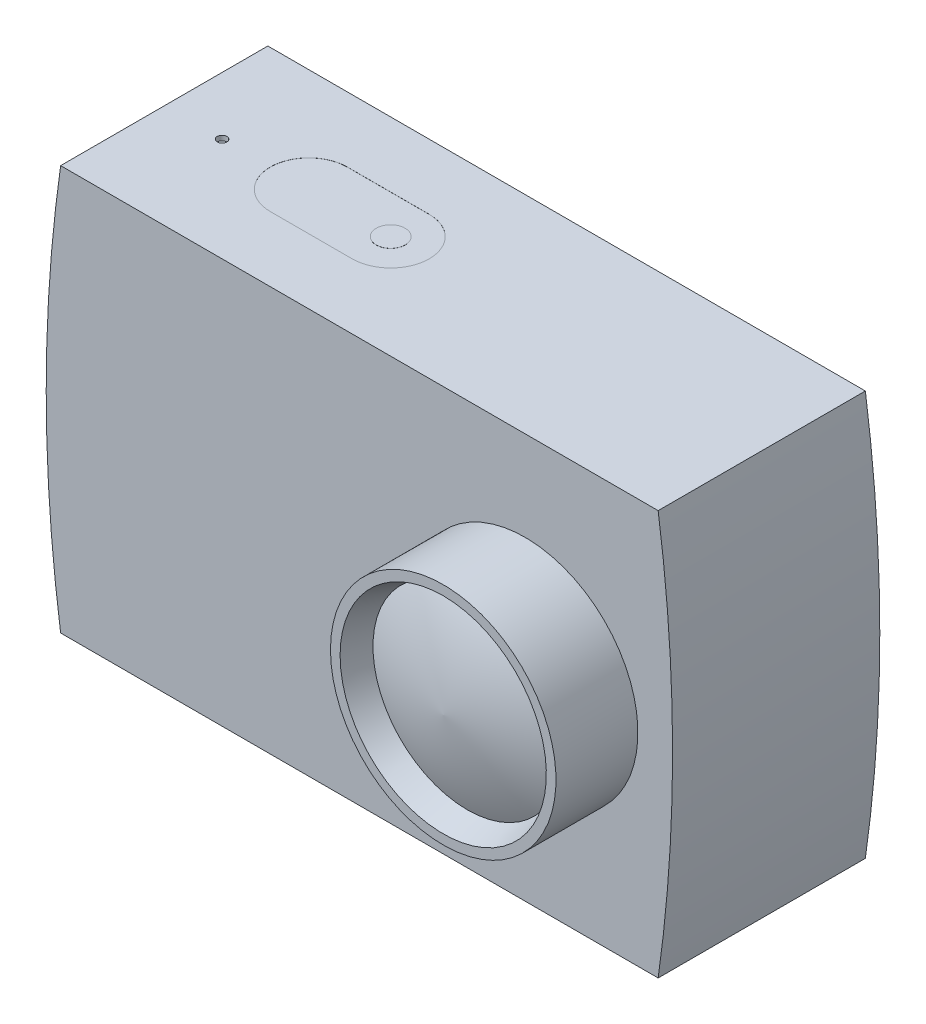
ISO-10303-21;
HEADER;
FILE_DESCRIPTION(('STEP AP214'),'2;1');
FILE_NAME('part.step','',(''),(''),'','','');
FILE_SCHEMA(('AUTOMOTIVE_DESIGN { 1 0 10303 214 1 1 1 1 }'));
ENDSEC;
DATA;
#1=APPLICATION_CONTEXT('core data for automotive mechanical design processes');
#2=APPLICATION_PROTOCOL_DEFINITION('international standard','automotive_design',2000,#1);
#3=PRODUCT_CONTEXT('',#1,'mechanical');
#4=PRODUCT('Part','Part','',(#3));
#5=PRODUCT_RELATED_PRODUCT_CATEGORY('part','',(#4));
#6=PRODUCT_DEFINITION_FORMATION('','',#4);
#7=PRODUCT_DEFINITION_CONTEXT('part definition',#1,'design');
#8=PRODUCT_DEFINITION('design','',#6,#7);
#9=PRODUCT_DEFINITION_SHAPE('','',#8);
#10=(LENGTH_UNIT() NAMED_UNIT(*) SI_UNIT(.MILLI.,.METRE.));
#11=(NAMED_UNIT(*) PLANE_ANGLE_UNIT() SI_UNIT($,.RADIAN.));
#12=(NAMED_UNIT(*) SI_UNIT($,.STERADIAN.) SOLID_ANGLE_UNIT());
#13=UNCERTAINTY_MEASURE_WITH_UNIT(LENGTH_MEASURE(1.E-05),#10,'distance_accuracy_value','');
#14=(GEOMETRIC_REPRESENTATION_CONTEXT(3) GLOBAL_UNCERTAINTY_ASSIGNED_CONTEXT((#13)) GLOBAL_UNIT_ASSIGNED_CONTEXT((#10,
#11,#12)) REPRESENTATION_CONTEXT('',''));
#15=CARTESIAN_POINT('',(0.,0.,0.));
#16=DIRECTION('',(0.,0.,1.));
#17=DIRECTION('',(1.,0.,0.));
#18=AXIS2_PLACEMENT_3D('',#15,#16,#17);
#19=CARTESIAN_POINT('',(-146.5025597046,21.,21.5));
#20=DIRECTION('',(0.,0.,-1.));
#21=DIRECTION('',(-1.,0.,0.));
#22=AXIS2_PLACEMENT_3D('',#19,#20,#21);
#23=CYLINDRICAL_SURFACE('',#22,148.);
#24=CARTESIAN_POINT('',(-146.5025597046,21.,0.));
#25=DIRECTION('',(0.,0.,1.));
#26=DIRECTION('',(-1.,0.,0.));
#27=AXIS2_PLACEMENT_3D('',#24,#25,#26);
#28=CIRCLE('',#27,148.);
#29=CARTESIAN_POINT('',(0.,0.,0.));
#30=VERTEX_POINT('',#29);
#31=CARTESIAN_POINT('',(0.,42.,0.));
#32=VERTEX_POINT('',#31);
#33=EDGE_CURVE('E171',#30,#32,#28,.T.);
#34=ORIENTED_EDGE('',*,*,#33,.T.);
#35=DIRECTION('',(0.,0.,-1.));
#36=VECTOR('',#35,1.);
#37=CARTESIAN_POINT('',(0.,42.,21.5));
#38=LINE('',#37,#36);
#39=CARTESIAN_POINT('',(0.,42.,21.5));
#40=VERTEX_POINT('',#39);
#41=EDGE_CURVE('E197',#40,#32,#38,.T.);
#42=ORIENTED_EDGE('',*,*,#41,.F.);
#43=CARTESIAN_POINT('',(-146.5025597046,21.,21.5));
#44=DIRECTION('',(0.,0.,1.));
#45=DIRECTION('',(-1.,0.,0.));
#46=AXIS2_PLACEMENT_3D('',#43,#44,#45);
#47=CIRCLE('',#46,148.);
#48=CARTESIAN_POINT('',(0.,0.,21.5));
#49=VERTEX_POINT('',#48);
#50=EDGE_CURVE('E177',#49,#40,#47,.T.);
#51=ORIENTED_EDGE('',*,*,#50,.F.);
#52=DIRECTION('',(0.,0.,-1.));
#53=VECTOR('',#52,1.);
#54=CARTESIAN_POINT('',(0.,0.,21.5));
#55=LINE('',#54,#53);
#56=EDGE_CURVE('E183',#49,#30,#55,.T.);
#57=ORIENTED_EDGE('',*,*,#56,.T.);
#58=EDGE_LOOP('',(#34,#42,#51,#57));
#59=FACE_BOUND('',#58,.T.);
#60=ADVANCED_FACE('F45',(#59),#23,.T.);
#61=CARTESIAN_POINT('',(-62.,42.,21.5));
#62=DIRECTION('',(0.,-1.,0.));
#63=DIRECTION('',(0.,0.,-1.));
#64=AXIS2_PLACEMENT_3D('',#61,#62,#63);
#65=PLANE('',#64);
#66=CARTESIAN_POINT('',(-56.,42.,10.75));
#67=DIRECTION('',(0.,1.,0.));
#68=DIRECTION('',(0.,0.,1.));
#69=AXIS2_PLACEMENT_3D('',#66,#67,#68);
#70=CIRCLE('',#69,0.499999999999999);
#71=CARTESIAN_POINT('',(-56.,42.,11.25));
#72=VERTEX_POINT('',#71);
#73=EDGE_CURVE('E137',#72,#72,#70,.T.);
#74=ORIENTED_EDGE('',*,*,#73,.F.);
#75=EDGE_LOOP('',(#74));
#76=FACE_BOUND('',#75,.T.);
#77=DIRECTION('',(1.,0.,0.));
#78=VECTOR('',#77,1.);
#79=CARTESIAN_POINT('',(-47.,42.,14.75));
#80=LINE('',#79,#78);
#81=CARTESIAN_POINT('',(-47.,42.,14.75));
#82=VERTEX_POINT('',#81);
#83=CARTESIAN_POINT('',(-38.5,42.,14.75));
#84=VERTEX_POINT('',#83);
#85=EDGE_CURVE('E161',#82,#84,#80,.T.);
#86=ORIENTED_EDGE('',*,*,#85,.F.);
#87=CARTESIAN_POINT('',(-47.,42.,10.75));
#88=DIRECTION('',(0.,1.,0.));
#89=DIRECTION('',(0.,0.,-1.));
#90=AXIS2_PLACEMENT_3D('',#87,#88,#89);
#91=CIRCLE('',#90,4.);
#92=CARTESIAN_POINT('',(-47.,42.,6.75));
#93=VERTEX_POINT('',#92);
#94=EDGE_CURVE('E59',#93,#82,#91,.T.);
#95=ORIENTED_EDGE('',*,*,#94,.F.);
#96=DIRECTION('',(-1.,0.,0.));
#97=VECTOR('',#96,1.);
#98=CARTESIAN_POINT('',(-47.,42.,6.75));
#99=LINE('',#98,#97);
#100=CARTESIAN_POINT('',(-38.5,42.,6.75000000000002));
#101=VERTEX_POINT('',#100);
#102=EDGE_CURVE('E150',#101,#93,#99,.T.);
#103=ORIENTED_EDGE('',*,*,#102,.F.);
#104=CARTESIAN_POINT('',(-38.5,42.,10.75));
#105=DIRECTION('',(0.,1.,0.));
#106=DIRECTION('',(0.,0.,-1.));
#107=AXIS2_PLACEMENT_3D('',#104,#105,#106);
#108=CIRCLE('',#107,3.99999999999999);
#109=EDGE_CURVE('E164',#84,#101,#108,.T.);
#110=ORIENTED_EDGE('',*,*,#109,.F.);
#111=EDGE_LOOP('',(#86,#95,#103,#110));
#112=FACE_BOUND('',#111,.T.);
#113=DIRECTION('',(-1.,0.,0.));
#114=VECTOR('',#113,1.);
#115=CARTESIAN_POINT('',(-62.,42.,0.));
#116=LINE('',#115,#114);
#117=CARTESIAN_POINT('',(-62.,42.,0.));
#118=VERTEX_POINT('',#117);
#119=EDGE_CURVE('E186',#32,#118,#116,.T.);
#120=ORIENTED_EDGE('',*,*,#119,.T.);
#121=DIRECTION('',(0.,0.,-1.));
#122=VECTOR('',#121,1.);
#123=CARTESIAN_POINT('',(-62.,42.,21.5));
#124=LINE('',#123,#122);
#125=CARTESIAN_POINT('',(-62.,42.,21.5));
#126=VERTEX_POINT('',#125);
#127=EDGE_CURVE('E194',#126,#118,#124,.T.);
#128=ORIENTED_EDGE('',*,*,#127,.F.);
#129=DIRECTION('',(-1.,0.,0.));
#130=VECTOR('',#129,1.);
#131=CARTESIAN_POINT('',(-62.,42.,21.5));
#132=LINE('',#131,#130);
#133=EDGE_CURVE('E97',#40,#126,#132,.T.);
#134=ORIENTED_EDGE('',*,*,#133,.F.);
#135=ORIENTED_EDGE('',*,*,#41,.T.);
#136=EDGE_LOOP('',(#120,#128,#134,#135));
#137=FACE_BOUND('',#136,.T.);
#138=ADVANCED_FACE('F222',(#76,#112,#137),#65,.F.);
#139=CARTESIAN_POINT('',(84.5025597046004,21.,21.5));
#140=DIRECTION('',(0.,0.,-1.));
#141=DIRECTION('',(-1.,0.,0.));
#142=AXIS2_PLACEMENT_3D('',#139,#140,#141);
#143=CYLINDRICAL_SURFACE('',#142,148.);
#144=CARTESIAN_POINT('',(84.5025597046004,21.,0.));
#145=DIRECTION('',(0.,0.,1.));
#146=DIRECTION('',(1.,0.,0.));
#147=AXIS2_PLACEMENT_3D('',#144,#145,#146);
#148=CIRCLE('',#147,148.);
#149=CARTESIAN_POINT('',(-62.,0.,0.));
#150=VERTEX_POINT('',#149);
#151=EDGE_CURVE('E188',#118,#150,#148,.T.);
#152=ORIENTED_EDGE('',*,*,#151,.T.);
#153=DIRECTION('',(0.,0.,-1.));
#154=VECTOR('',#153,1.);
#155=CARTESIAN_POINT('',(-62.,0.,21.5));
#156=LINE('',#155,#154);
#157=CARTESIAN_POINT('',(-62.,0.,21.5));
#158=VERTEX_POINT('',#157);
#159=EDGE_CURVE('E192',#158,#150,#156,.T.);
#160=ORIENTED_EDGE('',*,*,#159,.F.);
#161=CARTESIAN_POINT('',(84.5025597046004,21.,21.5));
#162=DIRECTION('',(0.,0.,1.));
#163=DIRECTION('',(1.,0.,0.));
#164=AXIS2_PLACEMENT_3D('',#161,#162,#163);
#165=CIRCLE('',#164,148.);
#166=EDGE_CURVE('E180',#126,#158,#165,.T.);
#167=ORIENTED_EDGE('',*,*,#166,.F.);
#168=ORIENTED_EDGE('',*,*,#127,.T.);
#169=EDGE_LOOP('',(#152,#160,#167,#168));
#170=FACE_BOUND('',#169,.T.);
#171=ADVANCED_FACE('F224',(#170),#143,.T.);
#172=CARTESIAN_POINT('',(0.,0.,21.5));
#173=DIRECTION('',(0.,1.,0.));
#174=DIRECTION('',(0.,0.,1.));
#175=AXIS2_PLACEMENT_3D('',#172,#173,#174);
#176=PLANE('',#175);
#177=DIRECTION('',(1.,0.,0.));
#178=VECTOR('',#177,1.);
#179=CARTESIAN_POINT('',(0.,0.,0.));
#180=LINE('',#179,#178);
#181=EDGE_CURVE('E89',#150,#30,#180,.T.);
#182=ORIENTED_EDGE('',*,*,#181,.T.);
#183=ORIENTED_EDGE('',*,*,#56,.F.);
#184=DIRECTION('',(1.,0.,0.));
#185=VECTOR('',#184,1.);
#186=CARTESIAN_POINT('',(0.,0.,21.5));
#187=LINE('',#186,#185);
#188=EDGE_CURVE('E68',#158,#49,#187,.T.);
#189=ORIENTED_EDGE('',*,*,#188,.F.);
#190=ORIENTED_EDGE('',*,*,#159,.T.);
#191=EDGE_LOOP('',(#182,#183,#189,#190));
#192=FACE_BOUND('',#191,.T.);
#193=ADVANCED_FACE('F236',(#192),#176,.F.);
#194=CARTESIAN_POINT('',(-146.5025597046,21.,21.5));
#195=DIRECTION('',(0.,0.,-1.));
#196=DIRECTION('',(-1.,0.,0.));
#197=AXIS2_PLACEMENT_3D('',#194,#195,#196);
#198=PLANE('',#197);
#199=CARTESIAN_POINT('',(-13.8025597046004,21.,21.5));
#200=DIRECTION('',(0.,0.,-1.));
#201=DIRECTION('',(-1.,0.,0.));
#202=AXIS2_PLACEMENT_3D('',#199,#200,#201);
#203=CIRCLE('',#202,11.7);
#204=CARTESIAN_POINT('',(-25.5025597046004,21.,21.5));
#205=VERTEX_POINT('',#204);
#206=EDGE_CURVE('E13',#205,#205,#203,.F.);
#207=ORIENTED_EDGE('',*,*,#206,.F.);
#208=EDGE_LOOP('',(#207));
#209=FACE_BOUND('',#208,.T.);
#210=ORIENTED_EDGE('',*,*,#50,.T.);
#211=ORIENTED_EDGE('',*,*,#133,.T.);
#212=ORIENTED_EDGE('',*,*,#166,.T.);
#213=ORIENTED_EDGE('',*,*,#188,.T.);
#214=EDGE_LOOP('',(#210,#211,#212,#213));
#215=FACE_BOUND('',#214,.T.);
#216=ADVANCED_FACE('F238',(#209,#215),#198,.F.);
#217=CARTESIAN_POINT('',(-146.5025597046,21.,0.));
#218=DIRECTION('',(0.,0.,-1.));
#219=DIRECTION('',(-1.,0.,0.));
#220=AXIS2_PLACEMENT_3D('',#217,#218,#219);
#221=PLANE('',#220);
#222=ORIENTED_EDGE('',*,*,#33,.F.);
#223=ORIENTED_EDGE('',*,*,#181,.F.);
#224=ORIENTED_EDGE('',*,*,#151,.F.);
#225=ORIENTED_EDGE('',*,*,#119,.F.);
#226=EDGE_LOOP('',(#222,#223,#224,#225));
#227=FACE_BOUND('',#226,.T.);
#228=ADVANCED_FACE('F233',(#227),#221,.T.);
#229=CARTESIAN_POINT('',(-47.,41.99,10.75));
#230=DIRECTION('',(0.,1.,0.));
#231=DIRECTION('',(0.,0.,1.));
#232=AXIS2_PLACEMENT_3D('',#229,#230,#231);
#233=CYLINDRICAL_SURFACE('',#232,4.);
#234=ORIENTED_EDGE('',*,*,#94,.T.);
#235=DIRECTION('',(0.,1.,0.));
#236=VECTOR('',#235,1.);
#237=CARTESIAN_POINT('',(-47.,41.99,14.75));
#238=LINE('',#237,#236);
#239=CARTESIAN_POINT('',(-47.,41.99,14.75));
#240=VERTEX_POINT('',#239);
#241=EDGE_CURVE('E159',#240,#82,#238,.T.);
#242=ORIENTED_EDGE('',*,*,#241,.F.);
#243=CARTESIAN_POINT('',(-47.,41.99,10.75));
#244=DIRECTION('',(0.,1.,0.));
#245=DIRECTION('',(0.,0.,-1.));
#246=AXIS2_PLACEMENT_3D('',#243,#244,#245);
#247=CIRCLE('',#246,4.);
#248=CARTESIAN_POINT('',(-47.,41.99,6.75));
#249=VERTEX_POINT('',#248);
#250=EDGE_CURVE('E146',#249,#240,#247,.T.);
#251=ORIENTED_EDGE('',*,*,#250,.F.);
#252=DIRECTION('',(0.,1.,0.));
#253=VECTOR('',#252,1.);
#254=CARTESIAN_POINT('',(-47.,41.99,6.75));
#255=LINE('',#254,#253);
#256=EDGE_CURVE('E169',#249,#93,#255,.T.);
#257=ORIENTED_EDGE('',*,*,#256,.T.);
#258=EDGE_LOOP('',(#234,#242,#251,#257));
#259=FACE_BOUND('',#258,.T.);
#260=ADVANCED_FACE('F211',(#259),#233,.F.);
#261=CARTESIAN_POINT('',(-47.,41.99,6.75));
#262=DIRECTION('',(0.,0.,-1.));
#263=DIRECTION('',(-1.,0.,0.));
#264=AXIS2_PLACEMENT_3D('',#261,#262,#263);
#265=PLANE('',#264);
#266=ORIENTED_EDGE('',*,*,#102,.T.);
#267=ORIENTED_EDGE('',*,*,#256,.F.);
#268=DIRECTION('',(-1.,0.,0.));
#269=VECTOR('',#268,1.);
#270=CARTESIAN_POINT('',(-47.,41.99,6.75));
#271=LINE('',#270,#269);
#272=CARTESIAN_POINT('',(-38.5,41.99,6.75000000000002));
#273=VERTEX_POINT('',#272);
#274=EDGE_CURVE('E156',#273,#249,#271,.T.);
#275=ORIENTED_EDGE('',*,*,#274,.F.);
#276=DIRECTION('',(0.,1.,0.));
#277=VECTOR('',#276,1.);
#278=CARTESIAN_POINT('',(-38.5,41.99,6.75000000000002));
#279=LINE('',#278,#277);
#280=EDGE_CURVE('E172',#273,#101,#279,.T.);
#281=ORIENTED_EDGE('',*,*,#280,.T.);
#282=EDGE_LOOP('',(#266,#267,#275,#281));
#283=FACE_BOUND('',#282,.T.);
#284=ADVANCED_FACE('F219',(#283),#265,.F.);
#285=CARTESIAN_POINT('',(-38.5,41.99,10.75));
#286=DIRECTION('',(0.,1.,0.));
#287=DIRECTION('',(0.,0.,1.));
#288=AXIS2_PLACEMENT_3D('',#285,#286,#287);
#289=CYLINDRICAL_SURFACE('',#288,3.99999999999999);
#290=ORIENTED_EDGE('',*,*,#109,.T.);
#291=ORIENTED_EDGE('',*,*,#280,.F.);
#292=CARTESIAN_POINT('',(-38.5,41.99,10.75));
#293=DIRECTION('',(0.,1.,0.));
#294=DIRECTION('',(0.,0.,-1.));
#295=AXIS2_PLACEMENT_3D('',#292,#293,#294);
#296=CIRCLE('',#295,3.99999999999999);
#297=CARTESIAN_POINT('',(-38.5,41.99,14.75));
#298=VERTEX_POINT('',#297);
#299=EDGE_CURVE('E153',#298,#273,#296,.T.);
#300=ORIENTED_EDGE('',*,*,#299,.F.);
#301=DIRECTION('',(0.,1.,0.));
#302=VECTOR('',#301,1.);
#303=CARTESIAN_POINT('',(-38.5,41.99,14.75));
#304=LINE('',#303,#302);
#305=EDGE_CURVE('E174',#298,#84,#304,.T.);
#306=ORIENTED_EDGE('',*,*,#305,.T.);
#307=EDGE_LOOP('',(#290,#291,#300,#306));
#308=FACE_BOUND('',#307,.T.);
#309=ADVANCED_FACE('F217',(#308),#289,.F.);
#310=CARTESIAN_POINT('',(-47.,41.99,14.75));
#311=DIRECTION('',(0.,0.,1.));
#312=DIRECTION('',(1.,0.,0.));
#313=AXIS2_PLACEMENT_3D('',#310,#311,#312);
#314=PLANE('',#313);
#315=ORIENTED_EDGE('',*,*,#85,.T.);
#316=ORIENTED_EDGE('',*,*,#305,.F.);
#317=DIRECTION('',(1.,0.,0.));
#318=VECTOR('',#317,1.);
#319=CARTESIAN_POINT('',(-47.,41.99,14.75));
#320=LINE('',#319,#318);
#321=EDGE_CURVE('E149',#240,#298,#320,.T.);
#322=ORIENTED_EDGE('',*,*,#321,.F.);
#323=ORIENTED_EDGE('',*,*,#241,.T.);
#324=EDGE_LOOP('',(#315,#316,#322,#323));
#325=FACE_BOUND('',#324,.T.);
#326=ADVANCED_FACE('F206',(#325),#314,.F.);
#327=CARTESIAN_POINT('',(-47.,41.99,10.75));
#328=DIRECTION('',(0.,-1.,0.));
#329=DIRECTION('',(0.,0.,-1.));
#330=AXIS2_PLACEMENT_3D('',#327,#328,#329);
#331=PLANE('',#330);
#332=CARTESIAN_POINT('',(-38.5,41.99,10.75));
#333=DIRECTION('',(0.,-1.,0.));
#334=DIRECTION('',(0.,0.,-1.));
#335=AXIS2_PLACEMENT_3D('',#332,#333,#334);
#336=CIRCLE('',#335,1.5);
#337=CARTESIAN_POINT('',(-38.5,41.99,9.25));
#338=VERTEX_POINT('',#337);
#339=EDGE_CURVE('E52',#338,#338,#336,.F.);
#340=ORIENTED_EDGE('',*,*,#339,.F.);
#341=EDGE_LOOP('',(#340));
#342=FACE_BOUND('',#341,.T.);
#343=ORIENTED_EDGE('',*,*,#250,.T.);
#344=ORIENTED_EDGE('',*,*,#321,.T.);
#345=ORIENTED_EDGE('',*,*,#299,.T.);
#346=ORIENTED_EDGE('',*,*,#274,.T.);
#347=EDGE_LOOP('',(#343,#344,#345,#346));
#348=FACE_BOUND('',#347,.T.);
#349=ADVANCED_FACE('F203',(#342,#348),#331,.F.);
#350=CARTESIAN_POINT('',(-38.5,42.,10.75));
#351=DIRECTION('',(0.,-1.,0.));
#352=DIRECTION('',(0.,0.,-1.));
#353=AXIS2_PLACEMENT_3D('',#350,#351,#352);
#354=CYLINDRICAL_SURFACE('',#353,1.5);
#355=CARTESIAN_POINT('',(-38.5,42.,10.75));
#356=DIRECTION('',(0.,1.,0.));
#357=DIRECTION('',(0.,0.,1.));
#358=AXIS2_PLACEMENT_3D('',#355,#356,#357);
#359=CIRCLE('',#358,1.5);
#360=CARTESIAN_POINT('',(-38.5,42.,9.25));
#361=VERTEX_POINT('',#360);
#362=EDGE_CURVE('E141',#361,#361,#359,.T.);
#363=CARTESIAN_POINT('',(-38.5,42.,9.25));
#364=CARTESIAN_POINT('',(-38.5,41.9998958333333,9.25));
#365=CARTESIAN_POINT('',(-38.5,41.9997916666667,9.25));
#366=CARTESIAN_POINT('',(-38.5,41.9995833333333,9.25));
#367=CARTESIAN_POINT('',(-38.5,41.9994791666667,9.25));
#368=CARTESIAN_POINT('',(-38.5,41.9992708333333,9.25));
#369=CARTESIAN_POINT('',(-38.5,41.9991666666667,9.25));
#370=CARTESIAN_POINT('',(-38.5,41.9989583333333,9.25));
#371=CARTESIAN_POINT('',(-38.5,41.9988541666667,9.25));
#372=CARTESIAN_POINT('',(-38.5,41.9986458333333,9.25));
#373=CARTESIAN_POINT('',(-38.5,41.9985416666667,9.25));
#374=CARTESIAN_POINT('',(-38.5,41.9983333333333,9.25));
#375=CARTESIAN_POINT('',(-38.5,41.9982291666667,9.25));
#376=CARTESIAN_POINT('',(-38.5,41.9980208333333,9.25));
#377=CARTESIAN_POINT('',(-38.5,41.9979166666667,9.25));
#378=CARTESIAN_POINT('',(-38.5,41.9977083333333,9.25));
#379=CARTESIAN_POINT('',(-38.5,41.9976041666667,9.25));
#380=CARTESIAN_POINT('',(-38.5,41.9973958333333,9.25));
#381=CARTESIAN_POINT('',(-38.5,41.9972916666667,9.25));
#382=CARTESIAN_POINT('',(-38.5,41.9970833333333,9.25));
#383=CARTESIAN_POINT('',(-38.5,41.9969791666667,9.25));
#384=CARTESIAN_POINT('',(-38.5,41.9967708333333,9.25));
#385=CARTESIAN_POINT('',(-38.5,41.9966666666667,9.25));
#386=CARTESIAN_POINT('',(-38.5,41.9964583333333,9.25));
#387=CARTESIAN_POINT('',(-38.5,41.9963541666667,9.25));
#388=CARTESIAN_POINT('',(-38.5,41.9961458333333,9.25));
#389=CARTESIAN_POINT('',(-38.5,41.9960416666667,9.25));
#390=CARTESIAN_POINT('',(-38.5,41.9958333333333,9.25));
#391=CARTESIAN_POINT('',(-38.5,41.9957291666667,9.25));
#392=CARTESIAN_POINT('',(-38.5,41.9955208333333,9.25));
#393=CARTESIAN_POINT('',(-38.5,41.9954166666667,9.25));
#394=CARTESIAN_POINT('',(-38.5,41.9952083333333,9.25));
#395=CARTESIAN_POINT('',(-38.5,41.9951041666667,9.25));
#396=CARTESIAN_POINT('',(-38.5,41.9948958333333,9.25));
#397=CARTESIAN_POINT('',(-38.5,41.9947916666667,9.25));
#398=CARTESIAN_POINT('',(-38.5,41.9945833333333,9.25));
#399=CARTESIAN_POINT('',(-38.5,41.9944791666667,9.25));
#400=CARTESIAN_POINT('',(-38.5,41.9942708333333,9.25));
#401=CARTESIAN_POINT('',(-38.5,41.9941666666667,9.25));
#402=CARTESIAN_POINT('',(-38.5,41.9939583333333,9.25));
#403=CARTESIAN_POINT('',(-38.5,41.9938541666667,9.25));
#404=CARTESIAN_POINT('',(-38.5,41.9936458333333,9.25));
#405=CARTESIAN_POINT('',(-38.5,41.9935416666667,9.25));
#406=CARTESIAN_POINT('',(-38.5,41.9933333333333,9.25));
#407=CARTESIAN_POINT('',(-38.5,41.9932291666667,9.25));
#408=CARTESIAN_POINT('',(-38.5,41.9930208333333,9.25));
#409=CARTESIAN_POINT('',(-38.5,41.9929166666667,9.25));
#410=CARTESIAN_POINT('',(-38.5,41.9927083333333,9.25));
#411=CARTESIAN_POINT('',(-38.5,41.9926041666667,9.25));
#412=CARTESIAN_POINT('',(-38.5,41.9923958333333,9.25));
#413=CARTESIAN_POINT('',(-38.5,41.9922916666667,9.25));
#414=CARTESIAN_POINT('',(-38.5,41.9920833333333,9.25));
#415=CARTESIAN_POINT('',(-38.5,41.9919791666667,9.25));
#416=CARTESIAN_POINT('',(-38.5,41.9917708333333,9.25));
#417=CARTESIAN_POINT('',(-38.5,41.9916666666667,9.25));
#418=CARTESIAN_POINT('',(-38.5,41.9914583333333,9.25));
#419=CARTESIAN_POINT('',(-38.5,41.9913541666667,9.25));
#420=CARTESIAN_POINT('',(-38.5,41.9911458333333,9.25));
#421=CARTESIAN_POINT('',(-38.5,41.9910416666667,9.25));
#422=CARTESIAN_POINT('',(-38.5,41.9908333333333,9.25));
#423=CARTESIAN_POINT('',(-38.5,41.9907291666667,9.25));
#424=CARTESIAN_POINT('',(-38.5,41.9905208333333,9.25));
#425=CARTESIAN_POINT('',(-38.5,41.9904166666667,9.25));
#426=CARTESIAN_POINT('',(-38.5,41.9902083333333,9.25));
#427=CARTESIAN_POINT('',(-38.5,41.9901041666667,9.25));
#428=CARTESIAN_POINT('',(-38.5,41.99,9.25));
#429=B_SPLINE_CURVE_WITH_KNOTS('',3,(#363,#364,#365,#366,#367,#368,#369,#370,#371,#372,#373,
#374,#375,#376,#377,#378,#379,#380,#381,#382,#383,#384,#385,#386,#387,#388,#389,#390,#391,#392,
#393,#394,#395,#396,#397,#398,#399,#400,#401,#402,#403,#404,#405,#406,#407,#408,#409,#410,#411,
#412,#413,#414,#415,#416,#417,#418,#419,#420,#421,#422,#423,#424,#425,#426,#427,#428),
.UNSPECIFIED.,.F.,.F.,(4,2,2,2,2,2,2,2,2,2,2,2,2,2,2,2,2,2,2,2,2,2,2,2,2,2,2,2,2,2,2,2,4),(0.,
0.000312500000002047,0.000625000000004095,0.000937500000006142,0.00125000000000125,
0.0015625000000033,0.00187500000000534,0.00218750000000045,0.0025000000000025,
0.00281250000000455,0.00312499999999966,0.0034375000000017,0.00375000000000375,
0.00406249999999886,0.00437500000000091,0.00468750000000295,0.005000000000005,
0.00531250000000011,0.00562500000000216,0.0059375000000042,0.00624999999999931,
0.00656250000000136,0.00687500000000341,0.00718749999999851,0.00750000000000056,
0.00781250000000261,0.00812499999999772,0.00843749999999976,0.00875000000000181,
0.00906249999999692,0.00937499999999897,0.00968750000000101,0.0100000000000031),.UNSPECIFIED.);
#430=EDGE_CURVE('BSEAM201',#361,#338,#429,.T.);
#431=ORIENTED_EDGE('',*,*,#362,.F.);
#432=ORIENTED_EDGE('',*,*,#339,.T.);
#433=ORIENTED_EDGE('',*,*,#430,.T.);
#434=ORIENTED_EDGE('',*,*,#430,.F.);
#435=EDGE_LOOP('',(#431,#433,#432,#434));
#436=FACE_BOUND('',#435,.T.);
#437=ADVANCED_FACE('F201',(#436),#354,.T.);
#438=CARTESIAN_POINT('',(-38.5,42.,10.75));
#439=DIRECTION('',(0.,1.,0.));
#440=DIRECTION('',(0.,0.,1.));
#441=AXIS2_PLACEMENT_3D('',#438,#439,#440);
#442=PLANE('',#441);
#443=ORIENTED_EDGE('',*,*,#362,.T.);
#444=EDGE_LOOP('',(#443));
#445=FACE_BOUND('',#444,.T.);
#446=ADVANCED_FACE('F319',(#445),#442,.T.);
#447=CARTESIAN_POINT('',(-56.,41.5,10.75));
#448=DIRECTION('',(0.,1.,0.));
#449=DIRECTION('',(0.,0.,1.));
#450=AXIS2_PLACEMENT_3D('',#447,#448,#449);
#451=CYLINDRICAL_SURFACE('',#450,0.499999999999999);
#452=CARTESIAN_POINT('',(-56.,41.5,10.75));
#453=DIRECTION('',(0.,1.,0.));
#454=DIRECTION('',(0.,0.,1.));
#455=AXIS2_PLACEMENT_3D('',#452,#453,#454);
#456=CIRCLE('',#455,0.499999999999999);
#457=CARTESIAN_POINT('',(-56.,41.5,11.25));
#458=VERTEX_POINT('',#457);
#459=EDGE_CURVE('E138',#458,#458,#456,.T.);
#460=ORIENTED_EDGE('',*,*,#459,.F.);
#461=EDGE_LOOP('',(#460));
#462=FACE_BOUND('',#461,.T.);
#463=ORIENTED_EDGE('',*,*,#73,.T.);
#464=EDGE_LOOP('',(#463));
#465=FACE_BOUND('',#464,.T.);
#466=ADVANCED_FACE('F328',(#462,#465),#451,.F.);
#467=CARTESIAN_POINT('',(-56.,41.5,10.75));
#468=DIRECTION('',(0.,1.,0.));
#469=DIRECTION('',(0.,0.,1.));
#470=AXIS2_PLACEMENT_3D('',#467,#468,#469);
#471=PLANE('',#470);
#472=ORIENTED_EDGE('',*,*,#459,.T.);
#473=EDGE_LOOP('',(#472));
#474=FACE_BOUND('',#473,.T.);
#475=ADVANCED_FACE('F338',(#474),#471,.T.);
#476=CARTESIAN_POINT('',(-13.8025597046004,21.,27.5));
#477=DIRECTION('',(0.,0.,1.));
#478=DIRECTION('',(1.,0.,0.));
#479=AXIS2_PLACEMENT_3D('',#476,#477,#478);
#480=CONICAL_SURFACE('',#479,9.7900744143345,0.349065850398863);
#481=CARTESIAN_POINT('',(-13.8025597046004,21.,30.));
#482=DIRECTION('',(0.,0.,-1.));
#483=DIRECTION('',(-1.,0.,0.));
#484=AXIS2_PLACEMENT_3D('',#481,#482,#483);
#485=CIRCLE('',#484,10.7);
#486=CARTESIAN_POINT('',(-24.5025597046004,21.,30.));
#487=VERTEX_POINT('',#486);
#488=EDGE_CURVE('E132',#487,#487,#485,.T.);
#489=ORIENTED_EDGE('',*,*,#488,.F.);
#490=EDGE_LOOP('',(#489));
#491=FACE_BOUND('',#490,.T.);
#492=CARTESIAN_POINT('',(-13.8025597046004,21.,27.5));
#493=DIRECTION('',(0.,0.,-1.));
#494=DIRECTION('',(0.,1.,0.));
#495=AXIS2_PLACEMENT_3D('',#492,#493,#494);
#496=CIRCLE('',#495,9.79007441433451);
#497=CARTESIAN_POINT('',(-13.8025597046004,30.7900744143345,27.5));
#498=VERTEX_POINT('',#497);
#499=EDGE_CURVE('E127',#498,#498,#496,.T.);
#500=ORIENTED_EDGE('',*,*,#499,.T.);
#501=EDGE_LOOP('',(#500));
#502=FACE_BOUND('',#501,.T.);
#503=ADVANCED_FACE('F345',(#491,#502),#480,.F.);
#504=CARTESIAN_POINT('',(-25.5025597046004,21.,30.));
#505=DIRECTION('',(0.,0.,-1.));
#506=DIRECTION('',(-1.,0.,0.));
#507=AXIS2_PLACEMENT_3D('',#504,#505,#506);
#508=PLANE('',#507);
#509=CARTESIAN_POINT('',(-13.8025597046004,21.,30.));
#510=DIRECTION('',(0.,0.,-1.));
#511=DIRECTION('',(-1.,0.,0.));
#512=AXIS2_PLACEMENT_3D('',#509,#510,#511);
#513=CIRCLE('',#512,11.7);
#514=CARTESIAN_POINT('',(-25.5025597046004,21.,30.));
#515=VERTEX_POINT('',#514);
#516=EDGE_CURVE('E129',#515,#515,#513,.T.);
#517=ORIENTED_EDGE('',*,*,#516,.F.);
#518=EDGE_LOOP('',(#517));
#519=FACE_BOUND('',#518,.T.);
#520=ORIENTED_EDGE('',*,*,#488,.T.);
#521=EDGE_LOOP('',(#520));
#522=FACE_BOUND('',#521,.T.);
#523=ADVANCED_FACE('F354',(#519,#522),#508,.F.);
#524=CARTESIAN_POINT('',(-13.8025597046004,21.,21.5));
#525=DIRECTION('',(0.,0.,-1.));
#526=DIRECTION('',(-1.,0.,0.));
#527=AXIS2_PLACEMENT_3D('',#524,#525,#526);
#528=CYLINDRICAL_SURFACE('',#527,11.7);
#529=ORIENTED_EDGE('',*,*,#206,.T.);
#530=EDGE_LOOP('',(#529));
#531=FACE_BOUND('',#530,.T.);
#532=ORIENTED_EDGE('',*,*,#516,.T.);
#533=EDGE_LOOP('',(#532));
#534=FACE_BOUND('',#533,.T.);
#535=ADVANCED_FACE('F123',(#531,#534),#528,.T.);
#536=CARTESIAN_POINT('',(-13.8025597046004,19.0400159029881,1.90553252809535));
#537=DIRECTION('',(-1.,0.,0.));
#538=DIRECTION('',(0.,1.,0.));
#539=AXIS2_PLACEMENT_3D('',#536,#537,#538);
#540=CIRCLE('',#539,28.1627527097485);
#541=TRIMMED_CURVE('',#540,(PARAMETER_VALUE(-1.50114511916127)),
(PARAMETER_VALUE(1.50114511916127)),.T.,.PARAMETER.);
#542=CARTESIAN_POINT('',(-13.8025597046004,21.,1.90553252809535));
#543=DIRECTION('',(0.,0.,-1.));
#544=AXIS1_PLACEMENT('',#542,#543);
#545=SURFACE_OF_REVOLUTION('',#541,#544);
#546=CARTESIAN_POINT('',(-13.8025597046004,21.,30.));
#547=VERTEX_POINT('',#546);
#548=VERTEX_LOOP('',#547);
#549=FACE_BOUND('',#548,.T.);
#550=ORIENTED_EDGE('',*,*,#499,.F.);
#551=EDGE_LOOP('',(#550));
#552=FACE_BOUND('',#551,.T.);
#553=ADVANCED_FACE('F120',(#549,#552),#545,.T.);
#554=CLOSED_SHELL('',(#60,#138,#171,#193,#216,#228,#260,#284,#309,#326,#349,#437,#446,#466,#475,
#503,#523,#535,#553));
#555=MANIFOLD_SOLID_BREP('B2',#554);
#556=ADVANCED_BREP_SHAPE_REPRESENTATION('',(#18,#555),#14);
#557=SHAPE_DEFINITION_REPRESENTATION(#9,#556);
ENDSEC;
END-ISO-10303-21;
